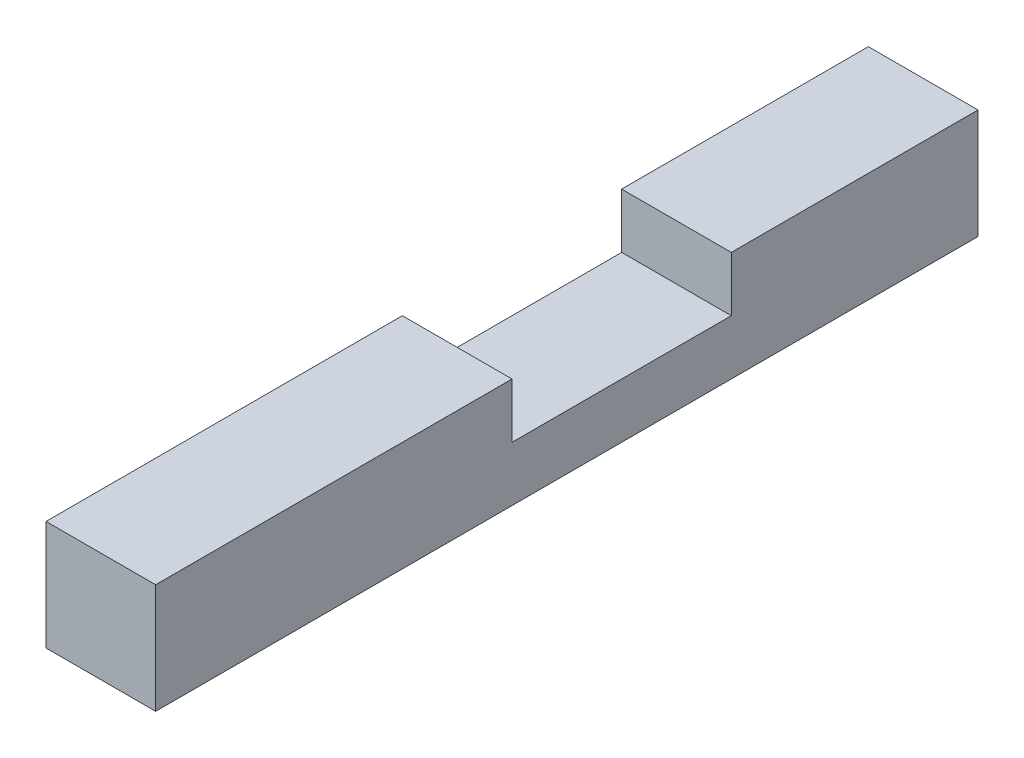
ISO-10303-21;
HEADER;
FILE_DESCRIPTION(('STEP AP214'),'2;1');
FILE_NAME('part.step','',(''),(''),'','','');
FILE_SCHEMA(('AUTOMOTIVE_DESIGN { 1 0 10303 214 1 1 1 1 }'));
ENDSEC;
DATA;
#1=APPLICATION_CONTEXT('core data for automotive mechanical design processes');
#2=APPLICATION_PROTOCOL_DEFINITION('international standard','automotive_design',2000,#1);
#3=PRODUCT_CONTEXT('',#1,'mechanical');
#4=PRODUCT('Part','Part','',(#3));
#5=PRODUCT_RELATED_PRODUCT_CATEGORY('part','',(#4));
#6=PRODUCT_DEFINITION_FORMATION('','',#4);
#7=PRODUCT_DEFINITION_CONTEXT('part definition',#1,'design');
#8=PRODUCT_DEFINITION('design','',#6,#7);
#9=PRODUCT_DEFINITION_SHAPE('','',#8);
#10=(LENGTH_UNIT() NAMED_UNIT(*) SI_UNIT(.MILLI.,.METRE.));
#11=(NAMED_UNIT(*) PLANE_ANGLE_UNIT() SI_UNIT($,.RADIAN.));
#12=(NAMED_UNIT(*) SI_UNIT($,.STERADIAN.) SOLID_ANGLE_UNIT());
#13=UNCERTAINTY_MEASURE_WITH_UNIT(LENGTH_MEASURE(1.E-05),#10,'distance_accuracy_value','');
#14=(GEOMETRIC_REPRESENTATION_CONTEXT(3) GLOBAL_UNCERTAINTY_ASSIGNED_CONTEXT((#13)) GLOBAL_UNIT_ASSIGNED_CONTEXT((#10,
#11,#12)) REPRESENTATION_CONTEXT('',''));
#15=CARTESIAN_POINT('',(0.,0.,0.));
#16=DIRECTION('',(0.,0.,1.));
#17=DIRECTION('',(1.,0.,0.));
#18=AXIS2_PLACEMENT_3D('',#15,#16,#17);
#19=CARTESIAN_POINT('',(-2.,2.,30.));
#20=DIRECTION('',(0.,1.,0.));
#21=DIRECTION('',(0.,0.,1.));
#22=AXIS2_PLACEMENT_3D('',#19,#20,#21);
#23=PLANE('',#22);
#24=DIRECTION('',(-1.,0.,0.));
#25=VECTOR('',#24,1.);
#26=CARTESIAN_POINT('',(2.,2.,9.));
#27=LINE('',#26,#25);
#28=CARTESIAN_POINT('',(2.,2.,9.));
#29=VERTEX_POINT('',#28);
#30=CARTESIAN_POINT('',(-2.,2.,9.));
#31=VERTEX_POINT('',#30);
#32=EDGE_CURVE('E141',#29,#31,#27,.T.);
#33=ORIENTED_EDGE('',*,*,#32,.F.);
#34=DIRECTION('',(0.,0.,-1.));
#35=VECTOR('',#34,1.);
#36=CARTESIAN_POINT('',(2.,2.,30.));
#37=LINE('',#36,#35);
#38=CARTESIAN_POINT('',(2.,2.,0.));
#39=VERTEX_POINT('',#38);
#40=EDGE_CURVE('E133',#29,#39,#37,.T.);
#41=ORIENTED_EDGE('',*,*,#40,.T.);
#42=DIRECTION('',(1.,0.,0.));
#43=VECTOR('',#42,1.);
#44=CARTESIAN_POINT('',(-2.,2.,0.));
#45=LINE('',#44,#43);
#46=CARTESIAN_POINT('',(-2.,2.,0.));
#47=VERTEX_POINT('',#46);
#48=EDGE_CURVE('E149',#47,#39,#45,.T.);
#49=ORIENTED_EDGE('',*,*,#48,.F.);
#50=DIRECTION('',(0.,0.,-1.));
#51=VECTOR('',#50,1.);
#52=CARTESIAN_POINT('',(-2.,2.,30.));
#53=LINE('',#52,#51);
#54=EDGE_CURVE('E81',#31,#47,#53,.T.);
#55=ORIENTED_EDGE('',*,*,#54,.F.);
#56=EDGE_LOOP('',(#33,#41,#49,#55));
#57=FACE_BOUND('',#56,.T.);
#58=ADVANCED_FACE('F35',(#57),#23,.T.);
#59=CARTESIAN_POINT('',(-2.,2.,30.));
#60=DIRECTION('',(1.,0.,0.));
#61=DIRECTION('',(0.,1.,0.));
#62=AXIS2_PLACEMENT_3D('',#59,#60,#61);
#63=PLANE('',#62);
#64=DIRECTION('',(0.,0.,1.));
#65=VECTOR('',#64,1.);
#66=CARTESIAN_POINT('',(-2.,0.,9.));
#67=LINE('',#66,#65);
#68=CARTESIAN_POINT('',(-2.,0.,9.));
#69=VERTEX_POINT('',#68);
#70=CARTESIAN_POINT('',(-2.,0.,17.));
#71=VERTEX_POINT('',#70);
#72=EDGE_CURVE('E135',#69,#71,#67,.T.);
#73=ORIENTED_EDGE('',*,*,#72,.F.);
#74=DIRECTION('',(0.,-1.,0.));
#75=VECTOR('',#74,1.);
#76=CARTESIAN_POINT('',(-2.,2.,9.));
#77=LINE('',#76,#75);
#78=EDGE_CURVE('E116',#31,#69,#77,.T.);
#79=ORIENTED_EDGE('',*,*,#78,.F.);
#80=ORIENTED_EDGE('',*,*,#54,.T.);
#81=DIRECTION('',(0.,-1.,0.));
#82=VECTOR('',#81,1.);
#83=CARTESIAN_POINT('',(-2.,2.,0.));
#84=LINE('',#83,#82);
#85=CARTESIAN_POINT('',(-2.,-2.,0.));
#86=VERTEX_POINT('',#85);
#87=EDGE_CURVE('E143',#47,#86,#84,.T.);
#88=ORIENTED_EDGE('',*,*,#87,.T.);
#89=DIRECTION('',(0.,0.,-1.));
#90=VECTOR('',#89,1.);
#91=CARTESIAN_POINT('',(-2.,-2.,30.));
#92=LINE('',#91,#90);
#93=CARTESIAN_POINT('',(-2.,-2.,30.));
#94=VERTEX_POINT('',#93);
#95=EDGE_CURVE('E11',#94,#86,#92,.T.);
#96=ORIENTED_EDGE('',*,*,#95,.F.);
#97=DIRECTION('',(0.,-1.,0.));
#98=VECTOR('',#97,1.);
#99=CARTESIAN_POINT('',(-2.,2.,30.));
#100=LINE('',#99,#98);
#101=CARTESIAN_POINT('',(-2.,2.,30.));
#102=VERTEX_POINT('',#101);
#103=EDGE_CURVE('E147',#102,#94,#100,.T.);
#104=ORIENTED_EDGE('',*,*,#103,.F.);
#105=CARTESIAN_POINT('',(-2.,2.,17.));
#106=VERTEX_POINT('',#105);
#107=EDGE_CURVE('E58',#102,#106,#53,.T.);
#108=ORIENTED_EDGE('',*,*,#107,.T.);
#109=DIRECTION('',(0.,1.,0.));
#110=VECTOR('',#109,1.);
#111=CARTESIAN_POINT('',(-2.,2.,17.));
#112=LINE('',#111,#110);
#113=EDGE_CURVE('E50',#71,#106,#112,.T.);
#114=ORIENTED_EDGE('',*,*,#113,.F.);
#115=EDGE_LOOP('',(#73,#79,#80,#88,#96,#104,#108,#114));
#116=FACE_BOUND('',#115,.T.);
#117=ADVANCED_FACE('F37',(#116),#63,.F.);
#118=CARTESIAN_POINT('',(-2.,-2.,30.));
#119=DIRECTION('',(0.,1.,0.));
#120=DIRECTION('',(0.,0.,1.));
#121=AXIS2_PLACEMENT_3D('',#118,#119,#120);
#122=PLANE('',#121);
#123=DIRECTION('',(1.,0.,0.));
#124=VECTOR('',#123,1.);
#125=CARTESIAN_POINT('',(-2.,-2.,0.));
#126=LINE('',#125,#124);
#127=CARTESIAN_POINT('',(2.,-2.,0.));
#128=VERTEX_POINT('',#127);
#129=EDGE_CURVE('E157',#86,#128,#126,.T.);
#130=ORIENTED_EDGE('',*,*,#129,.T.);
#131=DIRECTION('',(0.,0.,-1.));
#132=VECTOR('',#131,1.);
#133=CARTESIAN_POINT('',(2.,-2.,30.));
#134=LINE('',#133,#132);
#135=CARTESIAN_POINT('',(2.,-2.,30.));
#136=VERTEX_POINT('',#135);
#137=EDGE_CURVE('E43',#136,#128,#134,.T.);
#138=ORIENTED_EDGE('',*,*,#137,.F.);
#139=DIRECTION('',(1.,0.,0.));
#140=VECTOR('',#139,1.);
#141=CARTESIAN_POINT('',(-2.,-2.,30.));
#142=LINE('',#141,#140);
#143=EDGE_CURVE('E88',#94,#136,#142,.T.);
#144=ORIENTED_EDGE('',*,*,#143,.F.);
#145=ORIENTED_EDGE('',*,*,#95,.T.);
#146=EDGE_LOOP('',(#130,#138,#144,#145));
#147=FACE_BOUND('',#146,.T.);
#148=ADVANCED_FACE('F169',(#147),#122,.F.);
#149=CARTESIAN_POINT('',(2.,2.,30.));
#150=DIRECTION('',(1.,0.,0.));
#151=DIRECTION('',(0.,1.,0.));
#152=AXIS2_PLACEMENT_3D('',#149,#150,#151);
#153=PLANE('',#152);
#154=DIRECTION('',(0.,-1.,0.));
#155=VECTOR('',#154,1.);
#156=CARTESIAN_POINT('',(2.,2.,9.));
#157=LINE('',#156,#155);
#158=CARTESIAN_POINT('',(2.,0.,9.));
#159=VERTEX_POINT('',#158);
#160=EDGE_CURVE('E114',#29,#159,#157,.T.);
#161=ORIENTED_EDGE('',*,*,#160,.T.);
#162=DIRECTION('',(0.,0.,1.));
#163=VECTOR('',#162,1.);
#164=CARTESIAN_POINT('',(2.,0.,9.));
#165=LINE('',#164,#163);
#166=CARTESIAN_POINT('',(2.,0.,17.));
#167=VERTEX_POINT('',#166);
#168=EDGE_CURVE('E124',#159,#167,#165,.T.);
#169=ORIENTED_EDGE('',*,*,#168,.T.);
#170=DIRECTION('',(0.,1.,0.));
#171=VECTOR('',#170,1.);
#172=CARTESIAN_POINT('',(2.,2.,17.));
#173=LINE('',#172,#171);
#174=CARTESIAN_POINT('',(2.,2.,17.));
#175=VERTEX_POINT('',#174);
#176=EDGE_CURVE('E121',#167,#175,#173,.T.);
#177=ORIENTED_EDGE('',*,*,#176,.T.);
#178=CARTESIAN_POINT('',(2.,2.,30.));
#179=VERTEX_POINT('',#178);
#180=EDGE_CURVE('E166',#179,#175,#37,.T.);
#181=ORIENTED_EDGE('',*,*,#180,.F.);
#182=DIRECTION('',(0.,-1.,0.));
#183=VECTOR('',#182,1.);
#184=CARTESIAN_POINT('',(2.,2.,30.));
#185=LINE('',#184,#183);
#186=EDGE_CURVE('E151',#179,#136,#185,.T.);
#187=ORIENTED_EDGE('',*,*,#186,.T.);
#188=ORIENTED_EDGE('',*,*,#137,.T.);
#189=DIRECTION('',(0.,-1.,0.));
#190=VECTOR('',#189,1.);
#191=CARTESIAN_POINT('',(2.,2.,0.));
#192=LINE('',#191,#190);
#193=EDGE_CURVE('E160',#39,#128,#192,.T.);
#194=ORIENTED_EDGE('',*,*,#193,.F.);
#195=ORIENTED_EDGE('',*,*,#40,.F.);
#196=EDGE_LOOP('',(#161,#169,#177,#181,#187,#188,#194,#195));
#197=FACE_BOUND('',#196,.T.);
#198=ADVANCED_FACE('F131',(#197),#153,.T.);
#199=DIRECTION('',(-1.,0.,0.));
#200=VECTOR('',#199,1.);
#201=CARTESIAN_POINT('',(2.,2.,17.));
#202=LINE('',#201,#200);
#203=EDGE_CURVE('E144',#175,#106,#202,.T.);
#204=ORIENTED_EDGE('',*,*,#203,.T.);
#205=ORIENTED_EDGE('',*,*,#107,.F.);
#206=DIRECTION('',(1.,0.,0.));
#207=VECTOR('',#206,1.);
#208=CARTESIAN_POINT('',(-2.,2.,30.));
#209=LINE('',#208,#207);
#210=EDGE_CURVE('E154',#102,#179,#209,.T.);
#211=ORIENTED_EDGE('',*,*,#210,.T.);
#212=ORIENTED_EDGE('',*,*,#180,.T.);
#213=EDGE_LOOP('',(#204,#205,#211,#212));
#214=FACE_BOUND('',#213,.T.);
#215=ADVANCED_FACE('F178',(#214),#23,.T.);
#216=CARTESIAN_POINT('',(0.,0.,30.));
#217=DIRECTION('',(0.,0.,1.));
#218=DIRECTION('',(1.,0.,0.));
#219=AXIS2_PLACEMENT_3D('',#216,#217,#218);
#220=PLANE('',#219);
#221=ORIENTED_EDGE('',*,*,#103,.T.);
#222=ORIENTED_EDGE('',*,*,#143,.T.);
#223=ORIENTED_EDGE('',*,*,#186,.F.);
#224=ORIENTED_EDGE('',*,*,#210,.F.);
#225=EDGE_LOOP('',(#221,#222,#223,#224));
#226=FACE_BOUND('',#225,.T.);
#227=ADVANCED_FACE('F177',(#226),#220,.T.);
#228=CARTESIAN_POINT('',(0.,0.,0.));
#229=DIRECTION('',(0.,0.,1.));
#230=DIRECTION('',(1.,0.,0.));
#231=AXIS2_PLACEMENT_3D('',#228,#229,#230);
#232=PLANE('',#231);
#233=ORIENTED_EDGE('',*,*,#87,.F.);
#234=ORIENTED_EDGE('',*,*,#48,.T.);
#235=ORIENTED_EDGE('',*,*,#193,.T.);
#236=ORIENTED_EDGE('',*,*,#129,.F.);
#237=EDGE_LOOP('',(#233,#234,#235,#236));
#238=FACE_BOUND('',#237,.T.);
#239=ADVANCED_FACE('F172',(#238),#232,.F.);
#240=CARTESIAN_POINT('',(2.,2.,9.));
#241=DIRECTION('',(0.,0.,-1.));
#242=DIRECTION('',(-1.,0.,0.));
#243=AXIS2_PLACEMENT_3D('',#240,#241,#242);
#244=PLANE('',#243);
#245=ORIENTED_EDGE('',*,*,#78,.T.);
#246=DIRECTION('',(-1.,0.,0.));
#247=VECTOR('',#246,1.);
#248=CARTESIAN_POINT('',(2.,0.,9.));
#249=LINE('',#248,#247);
#250=EDGE_CURVE('E110',#159,#69,#249,.T.);
#251=ORIENTED_EDGE('',*,*,#250,.F.);
#252=ORIENTED_EDGE('',*,*,#160,.F.);
#253=ORIENTED_EDGE('',*,*,#32,.T.);
#254=EDGE_LOOP('',(#245,#251,#252,#253));
#255=FACE_BOUND('',#254,.T.);
#256=ADVANCED_FACE('F112',(#255),#244,.F.);
#257=CARTESIAN_POINT('',(2.,2.,17.));
#258=DIRECTION('',(0.,0.,1.));
#259=DIRECTION('',(1.,0.,0.));
#260=AXIS2_PLACEMENT_3D('',#257,#258,#259);
#261=PLANE('',#260);
#262=ORIENTED_EDGE('',*,*,#113,.T.);
#263=ORIENTED_EDGE('',*,*,#203,.F.);
#264=ORIENTED_EDGE('',*,*,#176,.F.);
#265=DIRECTION('',(-1.,0.,0.));
#266=VECTOR('',#265,1.);
#267=CARTESIAN_POINT('',(2.,0.,17.));
#268=LINE('',#267,#266);
#269=EDGE_CURVE('E120',#167,#71,#268,.T.);
#270=ORIENTED_EDGE('',*,*,#269,.T.);
#271=EDGE_LOOP('',(#262,#263,#264,#270));
#272=FACE_BOUND('',#271,.T.);
#273=ADVANCED_FACE('F179',(#272),#261,.F.);
#274=CARTESIAN_POINT('',(2.,0.,9.));
#275=DIRECTION('',(0.,-1.,0.));
#276=DIRECTION('',(1.,0.,0.));
#277=AXIS2_PLACEMENT_3D('',#274,#275,#276);
#278=PLANE('',#277);
#279=ORIENTED_EDGE('',*,*,#72,.T.);
#280=ORIENTED_EDGE('',*,*,#269,.F.);
#281=ORIENTED_EDGE('',*,*,#168,.F.);
#282=ORIENTED_EDGE('',*,*,#250,.T.);
#283=EDGE_LOOP('',(#279,#280,#281,#282));
#284=FACE_BOUND('',#283,.T.);
#285=ADVANCED_FACE('F125',(#284),#278,.F.);
#286=CLOSED_SHELL('',(#58,#117,#148,#198,#215,#227,#239,#256,#273,#285));
#287=MANIFOLD_SOLID_BREP('B2',#286);
#288=ADVANCED_BREP_SHAPE_REPRESENTATION('',(#18,#287),#14);
#289=SHAPE_DEFINITION_REPRESENTATION(#9,#288);
ENDSEC;
END-ISO-10303-21;
